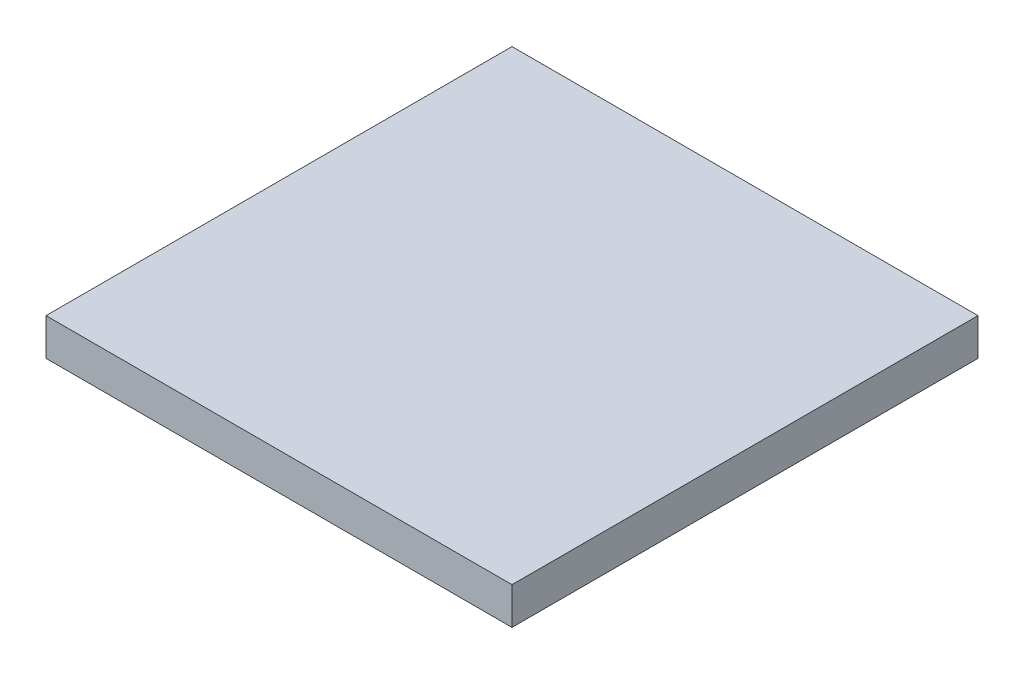
ISO-10303-21;
HEADER;
FILE_DESCRIPTION(('STEP AP214'),'2;1');
FILE_NAME('part.step','',(''),(''),'','','');
FILE_SCHEMA(('AUTOMOTIVE_DESIGN { 1 0 10303 214 1 1 1 1 }'));
ENDSEC;
DATA;
#1=APPLICATION_CONTEXT('core data for automotive mechanical design processes');
#2=APPLICATION_PROTOCOL_DEFINITION('international standard','automotive_design',2000,#1);
#3=PRODUCT_CONTEXT('',#1,'mechanical');
#4=PRODUCT('Part','Part','',(#3));
#5=PRODUCT_RELATED_PRODUCT_CATEGORY('part','',(#4));
#6=PRODUCT_DEFINITION_FORMATION('','',#4);
#7=PRODUCT_DEFINITION_CONTEXT('part definition',#1,'design');
#8=PRODUCT_DEFINITION('design','',#6,#7);
#9=PRODUCT_DEFINITION_SHAPE('','',#8);
#10=(LENGTH_UNIT() NAMED_UNIT(*) SI_UNIT(.MILLI.,.METRE.));
#11=(NAMED_UNIT(*) PLANE_ANGLE_UNIT() SI_UNIT($,.RADIAN.));
#12=(NAMED_UNIT(*) SI_UNIT($,.STERADIAN.) SOLID_ANGLE_UNIT());
#13=UNCERTAINTY_MEASURE_WITH_UNIT(LENGTH_MEASURE(1.E-05),#10,'distance_accuracy_value','');
#14=(GEOMETRIC_REPRESENTATION_CONTEXT(3) GLOBAL_UNCERTAINTY_ASSIGNED_CONTEXT((#13)) GLOBAL_UNIT_ASSIGNED_CONTEXT((#10,
#11,#12)) REPRESENTATION_CONTEXT('',''));
#15=CARTESIAN_POINT('',(0.,0.,0.));
#16=DIRECTION('',(0.,0.,1.));
#17=DIRECTION('',(1.,0.,0.));
#18=AXIS2_PLACEMENT_3D('',#15,#16,#17);
#19=CARTESIAN_POINT('',(457.2,72.644,-457.2));
#20=DIRECTION('',(-1.,0.,0.));
#21=DIRECTION('',(0.,0.,1.));
#22=AXIS2_PLACEMENT_3D('',#19,#20,#21);
#23=PLANE('',#22);
#24=DIRECTION('',(0.,0.,-1.));
#25=VECTOR('',#24,1.);
#26=CARTESIAN_POINT('',(457.2,0.,-457.2));
#27=LINE('',#26,#25);
#28=CARTESIAN_POINT('',(457.2,0.,457.2));
#29=VERTEX_POINT('',#28);
#30=CARTESIAN_POINT('',(457.2,0.,-457.2));
#31=VERTEX_POINT('',#30);
#32=EDGE_CURVE('E97',#29,#31,#27,.T.);
#33=ORIENTED_EDGE('',*,*,#32,.T.);
#34=DIRECTION('',(0.,-1.,0.));
#35=VECTOR('',#34,1.);
#36=CARTESIAN_POINT('',(457.2,72.644,-457.2));
#37=LINE('',#36,#35);
#38=CARTESIAN_POINT('',(457.2,72.644,-457.2));
#39=VERTEX_POINT('',#38);
#40=EDGE_CURVE('E11',#39,#31,#37,.T.);
#41=ORIENTED_EDGE('',*,*,#40,.F.);
#42=DIRECTION('',(0.,0.,-1.));
#43=VECTOR('',#42,1.);
#44=CARTESIAN_POINT('',(457.2,72.644,-457.2));
#45=LINE('',#44,#43);
#46=CARTESIAN_POINT('',(457.2,72.644,457.2));
#47=VERTEX_POINT('',#46);
#48=EDGE_CURVE('E85',#47,#39,#45,.T.);
#49=ORIENTED_EDGE('',*,*,#48,.F.);
#50=DIRECTION('',(0.,-1.,0.));
#51=VECTOR('',#50,1.);
#52=CARTESIAN_POINT('',(457.2,72.644,457.2));
#53=LINE('',#52,#51);
#54=EDGE_CURVE('E93',#47,#29,#53,.T.);
#55=ORIENTED_EDGE('',*,*,#54,.T.);
#56=EDGE_LOOP('',(#33,#41,#49,#55));
#57=FACE_BOUND('',#56,.T.);
#58=ADVANCED_FACE('F34',(#57),#23,.F.);
#59=CARTESIAN_POINT('',(-457.2,72.644,-457.2));
#60=DIRECTION('',(0.,0.,1.));
#61=DIRECTION('',(1.,0.,0.));
#62=AXIS2_PLACEMENT_3D('',#59,#60,#61);
#63=PLANE('',#62);
#64=DIRECTION('',(-1.,0.,0.));
#65=VECTOR('',#64,1.);
#66=CARTESIAN_POINT('',(-457.2,0.,-457.2));
#67=LINE('',#66,#65);
#68=CARTESIAN_POINT('',(-457.2,0.,-457.2));
#69=VERTEX_POINT('',#68);
#70=EDGE_CURVE('E89',#31,#69,#67,.T.);
#71=ORIENTED_EDGE('',*,*,#70,.T.);
#72=DIRECTION('',(0.,-1.,0.));
#73=VECTOR('',#72,1.);
#74=CARTESIAN_POINT('',(-457.2,72.644,-457.2));
#75=LINE('',#74,#73);
#76=CARTESIAN_POINT('',(-457.2,72.644,-457.2));
#77=VERTEX_POINT('',#76);
#78=EDGE_CURVE('E42',#77,#69,#75,.T.);
#79=ORIENTED_EDGE('',*,*,#78,.F.);
#80=DIRECTION('',(-1.,0.,0.));
#81=VECTOR('',#80,1.);
#82=CARTESIAN_POINT('',(-457.2,72.644,-457.2));
#83=LINE('',#82,#81);
#84=EDGE_CURVE('E80',#39,#77,#83,.T.);
#85=ORIENTED_EDGE('',*,*,#84,.F.);
#86=ORIENTED_EDGE('',*,*,#40,.T.);
#87=EDGE_LOOP('',(#71,#79,#85,#86));
#88=FACE_BOUND('',#87,.T.);
#89=ADVANCED_FACE('F88',(#88),#63,.F.);
#90=CARTESIAN_POINT('',(-457.2,72.644,-457.2));
#91=DIRECTION('',(1.,0.,0.));
#92=DIRECTION('',(0.,0.,-1.));
#93=AXIS2_PLACEMENT_3D('',#90,#91,#92);
#94=PLANE('',#93);
#95=DIRECTION('',(0.,0.,1.));
#96=VECTOR('',#95,1.);
#97=CARTESIAN_POINT('',(-457.2,0.,-457.2));
#98=LINE('',#97,#96);
#99=CARTESIAN_POINT('',(-457.2,0.,457.2));
#100=VERTEX_POINT('',#99);
#101=EDGE_CURVE('E67',#69,#100,#98,.T.);
#102=ORIENTED_EDGE('',*,*,#101,.T.);
#103=DIRECTION('',(0.,-1.,0.));
#104=VECTOR('',#103,1.);
#105=CARTESIAN_POINT('',(-457.2,72.644,457.2));
#106=LINE('',#105,#104);
#107=CARTESIAN_POINT('',(-457.2,72.644,457.2));
#108=VERTEX_POINT('',#107);
#109=EDGE_CURVE('E90',#108,#100,#106,.T.);
#110=ORIENTED_EDGE('',*,*,#109,.F.);
#111=DIRECTION('',(0.,0.,1.));
#112=VECTOR('',#111,1.);
#113=CARTESIAN_POINT('',(-457.2,72.644,-457.2));
#114=LINE('',#113,#112);
#115=EDGE_CURVE('E83',#77,#108,#114,.T.);
#116=ORIENTED_EDGE('',*,*,#115,.F.);
#117=ORIENTED_EDGE('',*,*,#78,.T.);
#118=EDGE_LOOP('',(#102,#110,#116,#117));
#119=FACE_BOUND('',#118,.T.);
#120=ADVANCED_FACE('F91',(#119),#94,.F.);
#121=CARTESIAN_POINT('',(-457.2,72.644,457.2));
#122=DIRECTION('',(0.,0.,-1.));
#123=DIRECTION('',(-1.,0.,0.));
#124=AXIS2_PLACEMENT_3D('',#121,#122,#123);
#125=PLANE('',#124);
#126=DIRECTION('',(1.,0.,0.));
#127=VECTOR('',#126,1.);
#128=CARTESIAN_POINT('',(-457.2,0.,457.2));
#129=LINE('',#128,#127);
#130=EDGE_CURVE('E73',#100,#29,#129,.T.);
#131=ORIENTED_EDGE('',*,*,#130,.T.);
#132=ORIENTED_EDGE('',*,*,#54,.F.);
#133=DIRECTION('',(1.,0.,0.));
#134=VECTOR('',#133,1.);
#135=CARTESIAN_POINT('',(-457.2,72.644,457.2));
#136=LINE('',#135,#134);
#137=EDGE_CURVE('E50',#108,#47,#136,.T.);
#138=ORIENTED_EDGE('',*,*,#137,.F.);
#139=ORIENTED_EDGE('',*,*,#109,.T.);
#140=EDGE_LOOP('',(#131,#132,#138,#139));
#141=FACE_BOUND('',#140,.T.);
#142=ADVANCED_FACE('F104',(#141),#125,.F.);
#143=CARTESIAN_POINT('',(0.,72.644,0.));
#144=DIRECTION('',(0.,1.,0.));
#145=DIRECTION('',(0.,0.,1.));
#146=AXIS2_PLACEMENT_3D('',#143,#144,#145);
#147=PLANE('',#146);
#148=ORIENTED_EDGE('',*,*,#48,.T.);
#149=ORIENTED_EDGE('',*,*,#84,.T.);
#150=ORIENTED_EDGE('',*,*,#115,.T.);
#151=ORIENTED_EDGE('',*,*,#137,.T.);
#152=EDGE_LOOP('',(#148,#149,#150,#151));
#153=FACE_BOUND('',#152,.T.);
#154=ADVANCED_FACE('F81',(#153),#147,.T.);
#155=CARTESIAN_POINT('',(0.,0.,0.));
#156=DIRECTION('',(0.,1.,0.));
#157=DIRECTION('',(0.,0.,1.));
#158=AXIS2_PLACEMENT_3D('',#155,#156,#157);
#159=PLANE('',#158);
#160=ORIENTED_EDGE('',*,*,#32,.F.);
#161=ORIENTED_EDGE('',*,*,#130,.F.);
#162=ORIENTED_EDGE('',*,*,#101,.F.);
#163=ORIENTED_EDGE('',*,*,#70,.F.);
#164=EDGE_LOOP('',(#160,#161,#162,#163));
#165=FACE_BOUND('',#164,.T.);
#166=ADVANCED_FACE('F107',(#165),#159,.F.);
#167=CLOSED_SHELL('',(#58,#89,#120,#142,#154,#166));
#168=MANIFOLD_SOLID_BREP('B2',#167);
#169=ADVANCED_BREP_SHAPE_REPRESENTATION('',(#18,#168),#14);
#170=SHAPE_DEFINITION_REPRESENTATION(#9,#169);
ENDSEC;
END-ISO-10303-21;
